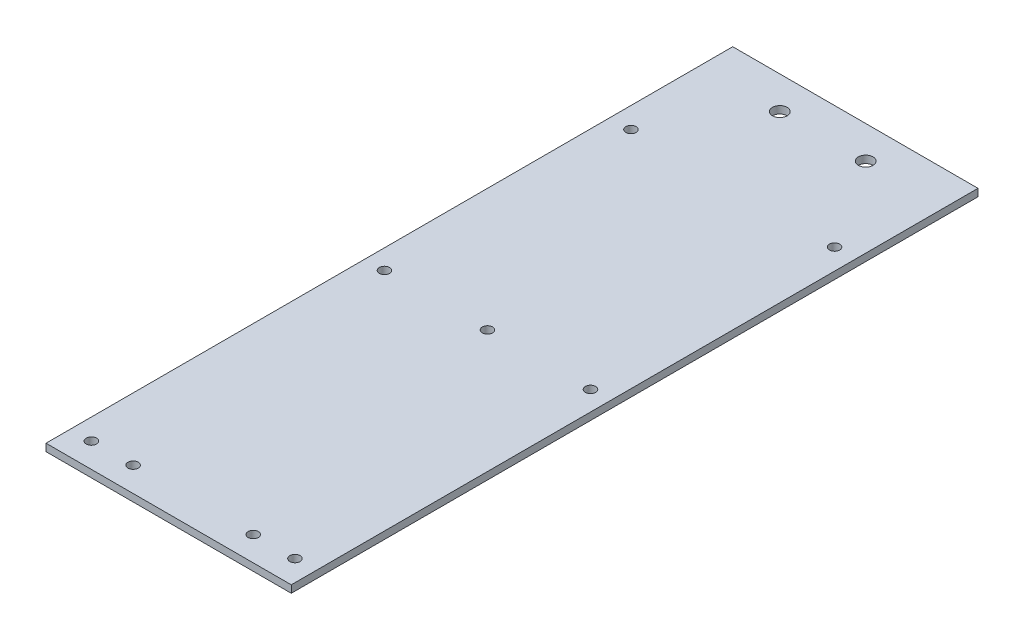
ISO-10303-21;
HEADER;
FILE_DESCRIPTION(('STEP AP214'),'2;1');
FILE_NAME('part.step','',(''),(''),'','','');
FILE_SCHEMA(('AUTOMOTIVE_DESIGN { 1 0 10303 214 1 1 1 1 }'));
ENDSEC;
DATA;
#1=APPLICATION_CONTEXT('core data for automotive mechanical design processes');
#2=APPLICATION_PROTOCOL_DEFINITION('international standard','automotive_design',2000,#1);
#3=PRODUCT_CONTEXT('',#1,'mechanical');
#4=PRODUCT('Part','Part','',(#3));
#5=PRODUCT_RELATED_PRODUCT_CATEGORY('part','',(#4));
#6=PRODUCT_DEFINITION_FORMATION('','',#4);
#7=PRODUCT_DEFINITION_CONTEXT('part definition',#1,'design');
#8=PRODUCT_DEFINITION('design','',#6,#7);
#9=PRODUCT_DEFINITION_SHAPE('','',#8);
#10=(LENGTH_UNIT() NAMED_UNIT(*) SI_UNIT(.MILLI.,.METRE.));
#11=(NAMED_UNIT(*) PLANE_ANGLE_UNIT() SI_UNIT($,.RADIAN.));
#12=(NAMED_UNIT(*) SI_UNIT($,.STERADIAN.) SOLID_ANGLE_UNIT());
#13=UNCERTAINTY_MEASURE_WITH_UNIT(LENGTH_MEASURE(1.E-05),#10,'distance_accuracy_value','');
#14=(GEOMETRIC_REPRESENTATION_CONTEXT(3) GLOBAL_UNCERTAINTY_ASSIGNED_CONTEXT((#13)) GLOBAL_UNIT_ASSIGNED_CONTEXT((#10,
#11,#12)) REPRESENTATION_CONTEXT('',''));
#15=CARTESIAN_POINT('',(0.,0.,0.));
#16=DIRECTION('',(0.,0.,1.));
#17=DIRECTION('',(1.,0.,0.));
#18=AXIS2_PLACEMENT_3D('',#15,#16,#17);
#19=CARTESIAN_POINT('',(0.,3.,0.));
#20=DIRECTION('',(0.,1.,0.));
#21=DIRECTION('',(0.,0.,1.));
#22=AXIS2_PLACEMENT_3D('',#19,#20,#21);
#23=PLANE('',#22);
#24=CARTESIAN_POINT('',(-42.,3.,-70.));
#25=DIRECTION('',(0.,1.,0.));
#26=DIRECTION('',(0.,0.,1.));
#27=AXIS2_PLACEMENT_3D('',#24,#25,#26);
#28=CIRCLE('',#27,2.1);
#29=CARTESIAN_POINT('',(-42.,3.,-67.9));
#30=VERTEX_POINT('',#29);
#31=EDGE_CURVE('E203',#30,#30,#28,.T.);
#32=ORIENTED_EDGE('',*,*,#31,.F.);
#33=EDGE_LOOP('',(#32));
#34=FACE_BOUND('',#33,.T.);
#35=CARTESIAN_POINT('',(0.,3.,-70.));
#36=DIRECTION('',(0.,1.,0.));
#37=DIRECTION('',(0.,0.,1.));
#38=AXIS2_PLACEMENT_3D('',#35,#36,#37);
#39=CIRCLE('',#38,2.1);
#40=CARTESIAN_POINT('',(0.,3.,-67.9));
#41=VERTEX_POINT('',#40);
#42=EDGE_CURVE('E211',#41,#41,#39,.T.);
#43=ORIENTED_EDGE('',*,*,#42,.F.);
#44=EDGE_LOOP('',(#43));
#45=FACE_BOUND('',#44,.T.);
#46=CARTESIAN_POINT('',(42.,3.,-70.));
#47=DIRECTION('',(0.,1.,0.));
#48=DIRECTION('',(0.,0.,1.));
#49=AXIS2_PLACEMENT_3D('',#46,#47,#48);
#50=CIRCLE('',#49,2.1);
#51=CARTESIAN_POINT('',(42.,3.,-67.9));
#52=VERTEX_POINT('',#51);
#53=EDGE_CURVE('E207',#52,#52,#50,.T.);
#54=ORIENTED_EDGE('',*,*,#53,.F.);
#55=EDGE_LOOP('',(#54));
#56=FACE_BOUND('',#55,.T.);
#57=CARTESIAN_POINT('',(41.4999999999999,3.,-170.));
#58=DIRECTION('',(0.,1.,0.));
#59=DIRECTION('',(0.,0.,1.));
#60=AXIS2_PLACEMENT_3D('',#57,#58,#59);
#61=CIRCLE('',#60,2.09999999999999);
#62=CARTESIAN_POINT('',(41.4999999999999,3.,-167.9));
#63=VERTEX_POINT('',#62);
#64=EDGE_CURVE('E225',#63,#63,#61,.T.);
#65=ORIENTED_EDGE('',*,*,#64,.F.);
#66=EDGE_LOOP('',(#65));
#67=FACE_BOUND('',#66,.T.);
#68=CARTESIAN_POINT('',(-41.5000000000001,3.,-170.));
#69=DIRECTION('',(0.,1.,0.));
#70=DIRECTION('',(0.,0.,1.));
#71=AXIS2_PLACEMENT_3D('',#68,#69,#70);
#72=CIRCLE('',#71,2.09999999999999);
#73=CARTESIAN_POINT('',(-41.5000000000001,3.,-167.9));
#74=VERTEX_POINT('',#73);
#75=EDGE_CURVE('E231',#74,#74,#72,.T.);
#76=ORIENTED_EDGE('',*,*,#75,.F.);
#77=EDGE_LOOP('',(#76));
#78=FACE_BOUND('',#77,.T.);
#79=CARTESIAN_POINT('',(-17.5,3.,-206.7));
#80=DIRECTION('',(0.,1.,0.));
#81=DIRECTION('',(0.,0.,1.));
#82=AXIS2_PLACEMENT_3D('',#79,#80,#81);
#83=CIRCLE('',#82,3.);
#84=CARTESIAN_POINT('',(-17.5,3.,-203.7));
#85=VERTEX_POINT('',#84);
#86=EDGE_CURVE('E237',#85,#85,#83,.T.);
#87=ORIENTED_EDGE('',*,*,#86,.F.);
#88=EDGE_LOOP('',(#87));
#89=FACE_BOUND('',#88,.T.);
#90=CARTESIAN_POINT('',(17.5,3.,-206.7));
#91=DIRECTION('',(0.,1.,0.));
#92=DIRECTION('',(0.,0.,1.));
#93=AXIS2_PLACEMENT_3D('',#90,#91,#92);
#94=CIRCLE('',#93,3.);
#95=CARTESIAN_POINT('',(17.5,3.,-203.7));
#96=VERTEX_POINT('',#95);
#97=EDGE_CURVE('E92',#96,#96,#94,.T.);
#98=ORIENTED_EDGE('',*,*,#97,.F.);
#99=EDGE_LOOP('',(#98));
#100=FACE_BOUND('',#99,.T.);
#101=CARTESIAN_POINT('',(-24.5,3.,50.));
#102=DIRECTION('',(0.,1.,0.));
#103=DIRECTION('',(0.,0.,1.));
#104=AXIS2_PLACEMENT_3D('',#101,#102,#103);
#105=CIRCLE('',#104,2.1);
#106=CARTESIAN_POINT('',(-24.5,3.,52.1));
#107=VERTEX_POINT('',#106);
#108=EDGE_CURVE('E104',#107,#107,#105,.T.);
#109=ORIENTED_EDGE('',*,*,#108,.F.);
#110=EDGE_LOOP('',(#109));
#111=FACE_BOUND('',#110,.T.);
#112=CARTESIAN_POINT('',(24.5,3.,50.));
#113=DIRECTION('',(0.,1.,0.));
#114=DIRECTION('',(0.,0.,1.));
#115=AXIS2_PLACEMENT_3D('',#112,#113,#114);
#116=CIRCLE('',#115,2.1);
#117=CARTESIAN_POINT('',(24.5,3.,52.1));
#118=VERTEX_POINT('',#117);
#119=EDGE_CURVE('E110',#118,#118,#116,.T.);
#120=ORIENTED_EDGE('',*,*,#119,.F.);
#121=EDGE_LOOP('',(#120));
#122=FACE_BOUND('',#121,.T.);
#123=CARTESIAN_POINT('',(41.5,3.,50.));
#124=DIRECTION('',(0.,1.,0.));
#125=DIRECTION('',(0.,0.,-1.));
#126=AXIS2_PLACEMENT_3D('',#123,#124,#125);
#127=CIRCLE('',#126,2.09999999999999);
#128=CARTESIAN_POINT('',(41.5,3.,47.9));
#129=VERTEX_POINT('',#128);
#130=EDGE_CURVE('E120',#129,#129,#127,.T.);
#131=ORIENTED_EDGE('',*,*,#130,.F.);
#132=EDGE_LOOP('',(#131));
#133=FACE_BOUND('',#132,.T.);
#134=DIRECTION('',(0.,0.,-1.));
#135=VECTOR('',#134,1.);
#136=CARTESIAN_POINT('',(50.,3.,-60.));
#137=LINE('',#136,#135);
#138=CARTESIAN_POINT('',(50.,3.,60.));
#139=VERTEX_POINT('',#138);
#140=CARTESIAN_POINT('',(50.,3.,-220.));
#141=VERTEX_POINT('',#140);
#142=EDGE_CURVE('E79',#139,#141,#137,.T.);
#143=ORIENTED_EDGE('',*,*,#142,.T.);
#144=DIRECTION('',(1.,0.,0.));
#145=VECTOR('',#144,1.);
#146=CARTESIAN_POINT('',(-50.,3.,-220.));
#147=LINE('',#146,#145);
#148=CARTESIAN_POINT('',(-50.,3.,-220.));
#149=VERTEX_POINT('',#148);
#150=EDGE_CURVE('E82',#149,#141,#147,.T.);
#151=ORIENTED_EDGE('',*,*,#150,.F.);
#152=DIRECTION('',(0.,0.,1.));
#153=VECTOR('',#152,1.);
#154=CARTESIAN_POINT('',(-50.,3.,-60.));
#155=LINE('',#154,#153);
#156=CARTESIAN_POINT('',(-50.,3.,60.));
#157=VERTEX_POINT('',#156);
#158=EDGE_CURVE('E74',#149,#157,#155,.T.);
#159=ORIENTED_EDGE('',*,*,#158,.T.);
#160=DIRECTION('',(1.,0.,0.));
#161=VECTOR('',#160,1.);
#162=CARTESIAN_POINT('',(-50.,3.,60.));
#163=LINE('',#162,#161);
#164=EDGE_CURVE('E49',#157,#139,#163,.T.);
#165=ORIENTED_EDGE('',*,*,#164,.T.);
#166=EDGE_LOOP('',(#143,#151,#159,#165));
#167=FACE_BOUND('',#166,.T.);
#168=CARTESIAN_POINT('',(-41.5,3.,50.));
#169=DIRECTION('',(0.,1.,0.));
#170=DIRECTION('',(0.,0.,1.));
#171=AXIS2_PLACEMENT_3D('',#168,#169,#170);
#172=CIRCLE('',#171,2.09999999999999);
#173=CARTESIAN_POINT('',(-41.5,3.,52.1));
#174=VERTEX_POINT('',#173);
#175=EDGE_CURVE('E114',#174,#174,#172,.T.);
#176=ORIENTED_EDGE('',*,*,#175,.F.);
#177=EDGE_LOOP('',(#176));
#178=FACE_BOUND('',#177,.T.);
#179=ADVANCED_FACE('F32',(#34,#45,#56,#67,#78,#89,#100,#111,#122,#133,#167,#178),#23,.T.);
#180=CARTESIAN_POINT('',(0.,0.,0.));
#181=DIRECTION('',(0.,1.,0.));
#182=DIRECTION('',(0.,0.,1.));
#183=AXIS2_PLACEMENT_3D('',#180,#181,#182);
#184=PLANE('',#183);
#185=CARTESIAN_POINT('',(-42.,0.,-70.));
#186=DIRECTION('',(0.,-1.,0.));
#187=DIRECTION('',(0.,0.,-1.));
#188=AXIS2_PLACEMENT_3D('',#185,#186,#187);
#189=CIRCLE('',#188,2.1);
#190=CARTESIAN_POINT('',(-42.,0.,-72.1));
#191=VERTEX_POINT('',#190);
#192=EDGE_CURVE('E206',#191,#191,#189,.T.);
#193=ORIENTED_EDGE('',*,*,#192,.F.);
#194=EDGE_LOOP('',(#193));
#195=FACE_BOUND('',#194,.T.);
#196=CARTESIAN_POINT('',(0.,0.,-70.));
#197=DIRECTION('',(0.,-1.,0.));
#198=DIRECTION('',(0.,0.,-1.));
#199=AXIS2_PLACEMENT_3D('',#196,#197,#198);
#200=CIRCLE('',#199,2.1);
#201=CARTESIAN_POINT('',(0.,0.,-72.1));
#202=VERTEX_POINT('',#201);
#203=EDGE_CURVE('E208',#202,#202,#200,.T.);
#204=ORIENTED_EDGE('',*,*,#203,.F.);
#205=EDGE_LOOP('',(#204));
#206=FACE_BOUND('',#205,.T.);
#207=CARTESIAN_POINT('',(42.,0.,-70.));
#208=DIRECTION('',(0.,-1.,0.));
#209=DIRECTION('',(0.,0.,-1.));
#210=AXIS2_PLACEMENT_3D('',#207,#208,#209);
#211=CIRCLE('',#210,2.1);
#212=CARTESIAN_POINT('',(42.,0.,-72.1));
#213=VERTEX_POINT('',#212);
#214=EDGE_CURVE('E214',#213,#213,#211,.T.);
#215=ORIENTED_EDGE('',*,*,#214,.F.);
#216=EDGE_LOOP('',(#215));
#217=FACE_BOUND('',#216,.T.);
#218=CARTESIAN_POINT('',(41.4999999999999,0.,-170.));
#219=DIRECTION('',(0.,-1.,0.));
#220=DIRECTION('',(0.,0.,-1.));
#221=AXIS2_PLACEMENT_3D('',#218,#219,#220);
#222=CIRCLE('',#221,2.09999999999999);
#223=CARTESIAN_POINT('',(41.4999999999999,0.,-172.1));
#224=VERTEX_POINT('',#223);
#225=EDGE_CURVE('E222',#224,#224,#222,.T.);
#226=ORIENTED_EDGE('',*,*,#225,.F.);
#227=EDGE_LOOP('',(#226));
#228=FACE_BOUND('',#227,.T.);
#229=CARTESIAN_POINT('',(-41.5000000000001,0.,-170.));
#230=DIRECTION('',(0.,-1.,0.));
#231=DIRECTION('',(0.,0.,-1.));
#232=AXIS2_PLACEMENT_3D('',#229,#230,#231);
#233=CIRCLE('',#232,2.09999999999999);
#234=CARTESIAN_POINT('',(-41.5000000000001,0.,-172.1));
#235=VERTEX_POINT('',#234);
#236=EDGE_CURVE('E228',#235,#235,#233,.T.);
#237=ORIENTED_EDGE('',*,*,#236,.F.);
#238=EDGE_LOOP('',(#237));
#239=FACE_BOUND('',#238,.T.);
#240=CARTESIAN_POINT('',(-17.5,0.,-206.7));
#241=DIRECTION('',(0.,-1.,0.));
#242=DIRECTION('',(0.,0.,-1.));
#243=AXIS2_PLACEMENT_3D('',#240,#241,#242);
#244=CIRCLE('',#243,3.);
#245=CARTESIAN_POINT('',(-17.5,0.,-209.7));
#246=VERTEX_POINT('',#245);
#247=EDGE_CURVE('E234',#246,#246,#244,.T.);
#248=ORIENTED_EDGE('',*,*,#247,.F.);
#249=EDGE_LOOP('',(#248));
#250=FACE_BOUND('',#249,.T.);
#251=CARTESIAN_POINT('',(17.5,0.,-206.7));
#252=DIRECTION('',(0.,-1.,0.));
#253=DIRECTION('',(0.,0.,-1.));
#254=AXIS2_PLACEMENT_3D('',#251,#252,#253);
#255=CIRCLE('',#254,3.);
#256=CARTESIAN_POINT('',(17.5,0.,-209.7));
#257=VERTEX_POINT('',#256);
#258=EDGE_CURVE('E95',#257,#257,#255,.T.);
#259=ORIENTED_EDGE('',*,*,#258,.F.);
#260=EDGE_LOOP('',(#259));
#261=FACE_BOUND('',#260,.T.);
#262=CARTESIAN_POINT('',(-24.5,0.,50.));
#263=DIRECTION('',(0.,-1.,0.));
#264=DIRECTION('',(0.,0.,-1.));
#265=AXIS2_PLACEMENT_3D('',#262,#263,#264);
#266=CIRCLE('',#265,2.1);
#267=CARTESIAN_POINT('',(-24.5,0.,47.9));
#268=VERTEX_POINT('',#267);
#269=EDGE_CURVE('E101',#268,#268,#266,.T.);
#270=ORIENTED_EDGE('',*,*,#269,.F.);
#271=EDGE_LOOP('',(#270));
#272=FACE_BOUND('',#271,.T.);
#273=CARTESIAN_POINT('',(24.5,0.,50.));
#274=DIRECTION('',(0.,-1.,0.));
#275=DIRECTION('',(0.,0.,-1.));
#276=AXIS2_PLACEMENT_3D('',#273,#274,#275);
#277=CIRCLE('',#276,2.1);
#278=CARTESIAN_POINT('',(24.5,0.,47.9));
#279=VERTEX_POINT('',#278);
#280=EDGE_CURVE('E107',#279,#279,#277,.T.);
#281=ORIENTED_EDGE('',*,*,#280,.F.);
#282=EDGE_LOOP('',(#281));
#283=FACE_BOUND('',#282,.T.);
#284=DIRECTION('',(0.,0.,-1.));
#285=VECTOR('',#284,1.);
#286=CARTESIAN_POINT('',(50.,0.,-60.));
#287=LINE('',#286,#285);
#288=CARTESIAN_POINT('',(50.,0.,60.));
#289=VERTEX_POINT('',#288);
#290=CARTESIAN_POINT('',(50.,0.,-220.));
#291=VERTEX_POINT('',#290);
#292=EDGE_CURVE('E123',#289,#291,#287,.T.);
#293=ORIENTED_EDGE('',*,*,#292,.F.);
#294=DIRECTION('',(1.,0.,0.));
#295=VECTOR('',#294,1.);
#296=CARTESIAN_POINT('',(-50.,0.,60.));
#297=LINE('',#296,#295);
#298=CARTESIAN_POINT('',(-50.,0.,60.));
#299=VERTEX_POINT('',#298);
#300=EDGE_CURVE('E126',#299,#289,#297,.T.);
#301=ORIENTED_EDGE('',*,*,#300,.F.);
#302=DIRECTION('',(0.,0.,1.));
#303=VECTOR('',#302,1.);
#304=CARTESIAN_POINT('',(-50.,0.,-60.));
#305=LINE('',#304,#303);
#306=CARTESIAN_POINT('',(-50.,0.,-220.));
#307=VERTEX_POINT('',#306);
#308=EDGE_CURVE('E60',#307,#299,#305,.T.);
#309=ORIENTED_EDGE('',*,*,#308,.F.);
#310=DIRECTION('',(-1.,0.,0.));
#311=VECTOR('',#310,1.);
#312=CARTESIAN_POINT('',(-50.,0.,-220.));
#313=LINE('',#312,#311);
#314=EDGE_CURVE('E91',#291,#307,#313,.T.);
#315=ORIENTED_EDGE('',*,*,#314,.F.);
#316=EDGE_LOOP('',(#293,#301,#309,#315));
#317=FACE_BOUND('',#316,.T.);
#318=CARTESIAN_POINT('',(41.5,0.,50.));
#319=DIRECTION('',(0.,1.,0.));
#320=DIRECTION('',(0.,0.,-1.));
#321=AXIS2_PLACEMENT_3D('',#318,#319,#320);
#322=CIRCLE('',#321,2.09999999999999);
#323=CARTESIAN_POINT('',(41.5,0.,47.9));
#324=VERTEX_POINT('',#323);
#325=EDGE_CURVE('E117',#324,#324,#322,.T.);
#326=ORIENTED_EDGE('',*,*,#325,.T.);
#327=EDGE_LOOP('',(#326));
#328=FACE_BOUND('',#327,.T.);
#329=CARTESIAN_POINT('',(-41.5,0.,50.));
#330=DIRECTION('',(0.,1.,0.));
#331=DIRECTION('',(0.,0.,1.));
#332=AXIS2_PLACEMENT_3D('',#329,#330,#331);
#333=CIRCLE('',#332,2.09999999999999);
#334=CARTESIAN_POINT('',(-41.5,0.,52.1));
#335=VERTEX_POINT('',#334);
#336=EDGE_CURVE('E113',#335,#335,#333,.T.);
#337=ORIENTED_EDGE('',*,*,#336,.T.);
#338=EDGE_LOOP('',(#337));
#339=FACE_BOUND('',#338,.T.);
#340=ADVANCED_FACE('F135',(#195,#206,#217,#228,#239,#250,#261,#272,#283,#317,#328,#339),#184,.F.);
#341=CARTESIAN_POINT('',(50.,3.,-60.));
#342=DIRECTION('',(-1.,0.,0.));
#343=DIRECTION('',(0.,0.,1.));
#344=AXIS2_PLACEMENT_3D('',#341,#342,#343);
#345=PLANE('',#344);
#346=ORIENTED_EDGE('',*,*,#292,.T.);
#347=DIRECTION('',(0.,-1.,0.));
#348=VECTOR('',#347,1.);
#349=CARTESIAN_POINT('',(50.,0.,-220.));
#350=LINE('',#349,#348);
#351=EDGE_CURVE('E88',#141,#291,#350,.T.);
#352=ORIENTED_EDGE('',*,*,#351,.F.);
#353=ORIENTED_EDGE('',*,*,#142,.F.);
#354=DIRECTION('',(0.,-1.,0.));
#355=VECTOR('',#354,1.);
#356=CARTESIAN_POINT('',(50.,3.,60.));
#357=LINE('',#356,#355);
#358=EDGE_CURVE('E41',#139,#289,#357,.T.);
#359=ORIENTED_EDGE('',*,*,#358,.T.);
#360=EDGE_LOOP('',(#346,#352,#353,#359));
#361=FACE_BOUND('',#360,.T.);
#362=ADVANCED_FACE('F34',(#361),#345,.F.);
#363=CARTESIAN_POINT('',(-50.,3.,-60.));
#364=DIRECTION('',(1.,0.,0.));
#365=DIRECTION('',(0.,0.,-1.));
#366=AXIS2_PLACEMENT_3D('',#363,#364,#365);
#367=PLANE('',#366);
#368=ORIENTED_EDGE('',*,*,#308,.T.);
#369=DIRECTION('',(0.,-1.,0.));
#370=VECTOR('',#369,1.);
#371=CARTESIAN_POINT('',(-50.,3.,60.));
#372=LINE('',#371,#370);
#373=EDGE_CURVE('E11',#157,#299,#372,.T.);
#374=ORIENTED_EDGE('',*,*,#373,.F.);
#375=ORIENTED_EDGE('',*,*,#158,.F.);
#376=DIRECTION('',(0.,1.,0.));
#377=VECTOR('',#376,1.);
#378=CARTESIAN_POINT('',(-50.,0.,-220.));
#379=LINE('',#378,#377);
#380=EDGE_CURVE('E78',#307,#149,#379,.T.);
#381=ORIENTED_EDGE('',*,*,#380,.F.);
#382=EDGE_LOOP('',(#368,#374,#375,#381));
#383=FACE_BOUND('',#382,.T.);
#384=ADVANCED_FACE('F76',(#383),#367,.F.);
#385=CARTESIAN_POINT('',(-50.,3.,60.));
#386=DIRECTION('',(0.,0.,-1.));
#387=DIRECTION('',(-1.,0.,0.));
#388=AXIS2_PLACEMENT_3D('',#385,#386,#387);
#389=PLANE('',#388);
#390=ORIENTED_EDGE('',*,*,#300,.T.);
#391=ORIENTED_EDGE('',*,*,#358,.F.);
#392=ORIENTED_EDGE('',*,*,#164,.F.);
#393=ORIENTED_EDGE('',*,*,#373,.T.);
#394=EDGE_LOOP('',(#390,#391,#392,#393));
#395=FACE_BOUND('',#394,.T.);
#396=ADVANCED_FACE('F137',(#395),#389,.F.);
#397=CARTESIAN_POINT('',(41.5,3.,50.));
#398=DIRECTION('',(0.,-1.,0.));
#399=DIRECTION('',(0.,0.,-1.));
#400=AXIS2_PLACEMENT_3D('',#397,#398,#399);
#401=CYLINDRICAL_SURFACE('',#400,2.09999999999999);
#402=ORIENTED_EDGE('',*,*,#130,.T.);
#403=EDGE_LOOP('',(#402));
#404=FACE_BOUND('',#403,.T.);
#405=ORIENTED_EDGE('',*,*,#325,.F.);
#406=EDGE_LOOP('',(#405));
#407=FACE_BOUND('',#406,.T.);
#408=ADVANCED_FACE('F139',(#404,#407),#401,.F.);
#409=CARTESIAN_POINT('',(-41.5,3.,50.));
#410=DIRECTION('',(0.,-1.,0.));
#411=DIRECTION('',(0.,0.,-1.));
#412=AXIS2_PLACEMENT_3D('',#409,#410,#411);
#413=CYLINDRICAL_SURFACE('',#412,2.09999999999999);
#414=ORIENTED_EDGE('',*,*,#175,.T.);
#415=EDGE_LOOP('',(#414));
#416=FACE_BOUND('',#415,.T.);
#417=ORIENTED_EDGE('',*,*,#336,.F.);
#418=EDGE_LOOP('',(#417));
#419=FACE_BOUND('',#418,.T.);
#420=ADVANCED_FACE('F145',(#416,#419),#413,.F.);
#421=CARTESIAN_POINT('',(24.5,10.,50.));
#422=DIRECTION('',(0.,-1.,0.));
#423=DIRECTION('',(0.,0.,-1.));
#424=AXIS2_PLACEMENT_3D('',#421,#422,#423);
#425=CYLINDRICAL_SURFACE('',#424,2.1);
#426=ORIENTED_EDGE('',*,*,#119,.T.);
#427=EDGE_LOOP('',(#426));
#428=FACE_BOUND('',#427,.T.);
#429=ORIENTED_EDGE('',*,*,#280,.T.);
#430=EDGE_LOOP('',(#429));
#431=FACE_BOUND('',#430,.T.);
#432=ADVANCED_FACE('F161',(#428,#431),#425,.F.);
#433=CARTESIAN_POINT('',(-24.5,10.,50.));
#434=DIRECTION('',(0.,-1.,0.));
#435=DIRECTION('',(0.,0.,-1.));
#436=AXIS2_PLACEMENT_3D('',#433,#434,#435);
#437=CYLINDRICAL_SURFACE('',#436,2.1);
#438=ORIENTED_EDGE('',*,*,#108,.T.);
#439=EDGE_LOOP('',(#438));
#440=FACE_BOUND('',#439,.T.);
#441=ORIENTED_EDGE('',*,*,#269,.T.);
#442=EDGE_LOOP('',(#441));
#443=FACE_BOUND('',#442,.T.);
#444=ADVANCED_FACE('F165',(#440,#443),#437,.F.);
#445=CARTESIAN_POINT('',(0.,0.,-220.));
#446=DIRECTION('',(0.,0.,-1.));
#447=DIRECTION('',(-1.,0.,0.));
#448=AXIS2_PLACEMENT_3D('',#445,#446,#447);
#449=PLANE('',#448);
#450=ORIENTED_EDGE('',*,*,#380,.T.);
#451=ORIENTED_EDGE('',*,*,#150,.T.);
#452=ORIENTED_EDGE('',*,*,#351,.T.);
#453=ORIENTED_EDGE('',*,*,#314,.T.);
#454=EDGE_LOOP('',(#450,#451,#452,#453));
#455=FACE_BOUND('',#454,.T.);
#456=ADVANCED_FACE('F90',(#455),#449,.T.);
#457=CARTESIAN_POINT('',(17.5,160.,-206.7));
#458=DIRECTION('',(0.,-1.,0.));
#459=DIRECTION('',(0.,0.,-1.));
#460=AXIS2_PLACEMENT_3D('',#457,#458,#459);
#461=CYLINDRICAL_SURFACE('',#460,3.);
#462=ORIENTED_EDGE('',*,*,#97,.T.);
#463=EDGE_LOOP('',(#462));
#464=FACE_BOUND('',#463,.T.);
#465=ORIENTED_EDGE('',*,*,#258,.T.);
#466=EDGE_LOOP('',(#465));
#467=FACE_BOUND('',#466,.T.);
#468=ADVANCED_FACE('F172',(#464,#467),#461,.F.);
#469=CARTESIAN_POINT('',(-17.5,160.,-206.7));
#470=DIRECTION('',(0.,-1.,0.));
#471=DIRECTION('',(0.,0.,-1.));
#472=AXIS2_PLACEMENT_3D('',#469,#470,#471);
#473=CYLINDRICAL_SURFACE('',#472,3.);
#474=ORIENTED_EDGE('',*,*,#86,.T.);
#475=EDGE_LOOP('',(#474));
#476=FACE_BOUND('',#475,.T.);
#477=ORIENTED_EDGE('',*,*,#247,.T.);
#478=EDGE_LOOP('',(#477));
#479=FACE_BOUND('',#478,.T.);
#480=ADVANCED_FACE('F175',(#476,#479),#473,.F.);
#481=CARTESIAN_POINT('',(-41.5000000000001,160.,-170.));
#482=DIRECTION('',(0.,-1.,0.));
#483=DIRECTION('',(0.,0.,-1.));
#484=AXIS2_PLACEMENT_3D('',#481,#482,#483);
#485=CYLINDRICAL_SURFACE('',#484,2.09999999999999);
#486=ORIENTED_EDGE('',*,*,#75,.T.);
#487=EDGE_LOOP('',(#486));
#488=FACE_BOUND('',#487,.T.);
#489=ORIENTED_EDGE('',*,*,#236,.T.);
#490=EDGE_LOOP('',(#489));
#491=FACE_BOUND('',#490,.T.);
#492=ADVANCED_FACE('F179',(#488,#491),#485,.F.);
#493=CARTESIAN_POINT('',(41.4999999999999,160.,-170.));
#494=DIRECTION('',(0.,-1.,0.));
#495=DIRECTION('',(0.,0.,-1.));
#496=AXIS2_PLACEMENT_3D('',#493,#494,#495);
#497=CYLINDRICAL_SURFACE('',#496,2.09999999999999);
#498=ORIENTED_EDGE('',*,*,#64,.T.);
#499=EDGE_LOOP('',(#498));
#500=FACE_BOUND('',#499,.T.);
#501=ORIENTED_EDGE('',*,*,#225,.T.);
#502=EDGE_LOOP('',(#501));
#503=FACE_BOUND('',#502,.T.);
#504=ADVANCED_FACE('F183',(#500,#503),#497,.F.);
#505=CARTESIAN_POINT('',(42.,10.,-70.));
#506=DIRECTION('',(0.,-1.,0.));
#507=DIRECTION('',(0.,0.,-1.));
#508=AXIS2_PLACEMENT_3D('',#505,#506,#507);
#509=CYLINDRICAL_SURFACE('',#508,2.1);
#510=ORIENTED_EDGE('',*,*,#53,.T.);
#511=EDGE_LOOP('',(#510));
#512=FACE_BOUND('',#511,.T.);
#513=ORIENTED_EDGE('',*,*,#214,.T.);
#514=EDGE_LOOP('',(#513));
#515=FACE_BOUND('',#514,.T.);
#516=ADVANCED_FACE('F187',(#512,#515),#509,.F.);
#517=CARTESIAN_POINT('',(0.,10.,-70.));
#518=DIRECTION('',(0.,-1.,0.));
#519=DIRECTION('',(0.,0.,-1.));
#520=AXIS2_PLACEMENT_3D('',#517,#518,#519);
#521=CYLINDRICAL_SURFACE('',#520,2.1);
#522=ORIENTED_EDGE('',*,*,#42,.T.);
#523=EDGE_LOOP('',(#522));
#524=FACE_BOUND('',#523,.T.);
#525=ORIENTED_EDGE('',*,*,#203,.T.);
#526=EDGE_LOOP('',(#525));
#527=FACE_BOUND('',#526,.T.);
#528=ADVANCED_FACE('F191',(#524,#527),#521,.F.);
#529=CARTESIAN_POINT('',(-42.,10.,-70.));
#530=DIRECTION('',(0.,-1.,0.));
#531=DIRECTION('',(0.,0.,-1.));
#532=AXIS2_PLACEMENT_3D('',#529,#530,#531);
#533=CYLINDRICAL_SURFACE('',#532,2.1);
#534=ORIENTED_EDGE('',*,*,#31,.T.);
#535=EDGE_LOOP('',(#534));
#536=FACE_BOUND('',#535,.T.);
#537=ORIENTED_EDGE('',*,*,#192,.T.);
#538=EDGE_LOOP('',(#537));
#539=FACE_BOUND('',#538,.T.);
#540=ADVANCED_FACE('F195',(#536,#539),#533,.F.);
#541=CLOSED_SHELL('',(#179,#340,#362,#384,#396,#408,#420,#432,#444,#456,#468,#480,#492,#504,
#516,#528,#540));
#542=MANIFOLD_SOLID_BREP('B2',#541);
#543=ADVANCED_BREP_SHAPE_REPRESENTATION('',(#18,#542),#14);
#544=SHAPE_DEFINITION_REPRESENTATION(#9,#543);
ENDSEC;
END-ISO-10303-21;
